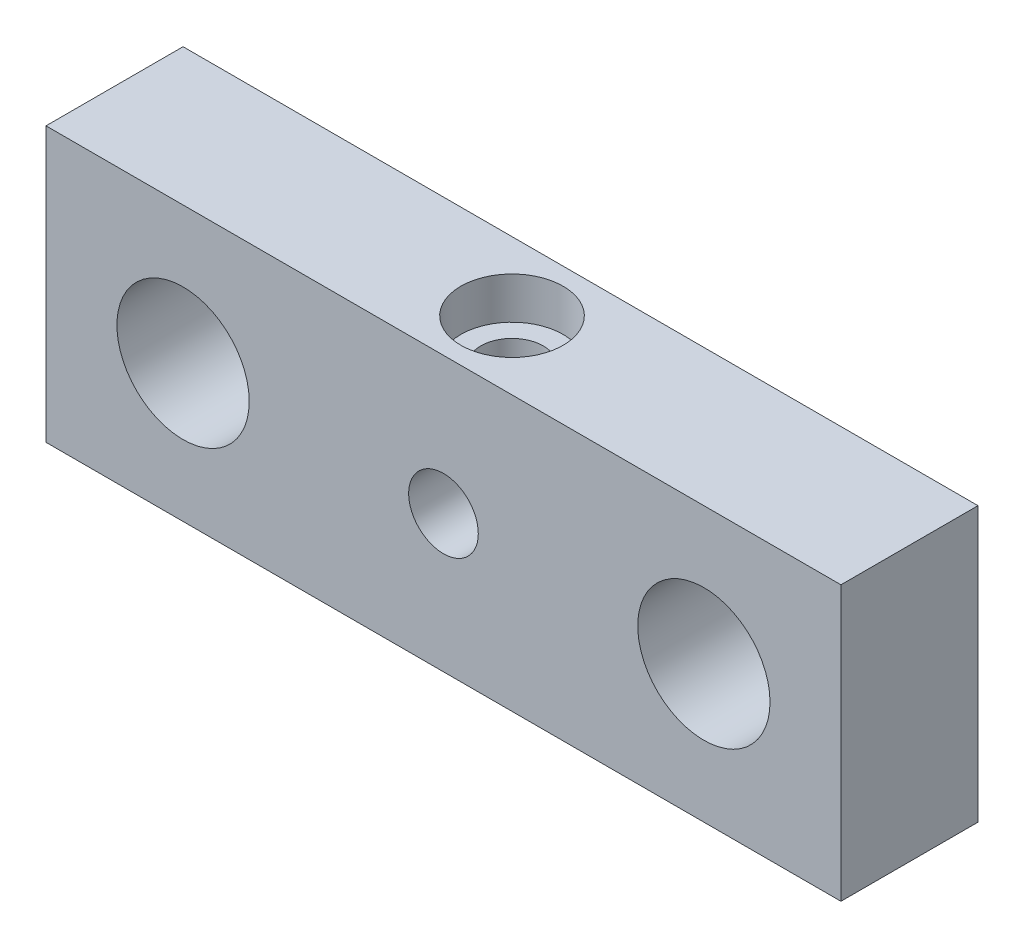
ISO-10303-21;
HEADER;
FILE_DESCRIPTION(('STEP AP214'),'2;1');
FILE_NAME('part.step','',(''),(''),'','','');
FILE_SCHEMA(('AUTOMOTIVE_DESIGN { 1 0 10303 214 1 1 1 1 }'));
ENDSEC;
DATA;
#1=APPLICATION_CONTEXT('core data for automotive mechanical design processes');
#2=APPLICATION_PROTOCOL_DEFINITION('international standard','automotive_design',2000,#1);
#3=PRODUCT_CONTEXT('',#1,'mechanical');
#4=PRODUCT('Part','Part','',(#3));
#5=PRODUCT_RELATED_PRODUCT_CATEGORY('part','',(#4));
#6=PRODUCT_DEFINITION_FORMATION('','',#4);
#7=PRODUCT_DEFINITION_CONTEXT('part definition',#1,'design');
#8=PRODUCT_DEFINITION('design','',#6,#7);
#9=PRODUCT_DEFINITION_SHAPE('','',#8);
#10=(LENGTH_UNIT() NAMED_UNIT(*) SI_UNIT(.MILLI.,.METRE.));
#11=(NAMED_UNIT(*) PLANE_ANGLE_UNIT() SI_UNIT($,.RADIAN.));
#12=(NAMED_UNIT(*) SI_UNIT($,.STERADIAN.) SOLID_ANGLE_UNIT());
#13=UNCERTAINTY_MEASURE_WITH_UNIT(LENGTH_MEASURE(1.E-05),#10,'distance_accuracy_value','');
#14=(GEOMETRIC_REPRESENTATION_CONTEXT(3) GLOBAL_UNCERTAINTY_ASSIGNED_CONTEXT((#13)) GLOBAL_UNIT_ASSIGNED_CONTEXT((#10,
#11,#12)) REPRESENTATION_CONTEXT('',''));
#15=CARTESIAN_POINT('',(0.,0.,0.));
#16=DIRECTION('',(0.,0.,1.));
#17=DIRECTION('',(1.,0.,0.));
#18=AXIS2_PLACEMENT_3D('',#15,#16,#17);
#19=CARTESIAN_POINT('',(-14.5,5.,5.));
#20=DIRECTION('',(1.,0.,0.));
#21=DIRECTION('',(0.,1.,0.));
#22=AXIS2_PLACEMENT_3D('',#19,#20,#21);
#23=PLANE('',#22);
#24=DIRECTION('',(0.,-1.,0.));
#25=VECTOR('',#24,1.);
#26=CARTESIAN_POINT('',(-14.5,5.,0.));
#27=LINE('',#26,#25);
#28=CARTESIAN_POINT('',(-14.5,5.,0.));
#29=VERTEX_POINT('',#28);
#30=CARTESIAN_POINT('',(-14.5,-5.,0.));
#31=VERTEX_POINT('',#30);
#32=EDGE_CURVE('E97',#29,#31,#27,.T.);
#33=ORIENTED_EDGE('',*,*,#32,.T.);
#34=DIRECTION('',(0.,0.,-1.));
#35=VECTOR('',#34,1.);
#36=CARTESIAN_POINT('',(-14.5,-5.,5.));
#37=LINE('',#36,#35);
#38=CARTESIAN_POINT('',(-14.5,-5.,5.));
#39=VERTEX_POINT('',#38);
#40=EDGE_CURVE('E11',#39,#31,#37,.T.);
#41=ORIENTED_EDGE('',*,*,#40,.F.);
#42=DIRECTION('',(0.,-1.,0.));
#43=VECTOR('',#42,1.);
#44=CARTESIAN_POINT('',(-14.5,5.,5.));
#45=LINE('',#44,#43);
#46=CARTESIAN_POINT('',(-14.5,5.,5.));
#47=VERTEX_POINT('',#46);
#48=EDGE_CURVE('E85',#47,#39,#45,.T.);
#49=ORIENTED_EDGE('',*,*,#48,.F.);
#50=DIRECTION('',(0.,0.,-1.));
#51=VECTOR('',#50,1.);
#52=CARTESIAN_POINT('',(-14.5,5.,5.));
#53=LINE('',#52,#51);
#54=EDGE_CURVE('E93',#47,#29,#53,.T.);
#55=ORIENTED_EDGE('',*,*,#54,.T.);
#56=EDGE_LOOP('',(#33,#41,#49,#55));
#57=FACE_BOUND('',#56,.T.);
#58=ADVANCED_FACE('F34',(#57),#23,.F.);
#59=CARTESIAN_POINT('',(-14.5,-5.,5.));
#60=DIRECTION('',(0.,1.,0.));
#61=DIRECTION('',(0.,0.,1.));
#62=AXIS2_PLACEMENT_3D('',#59,#60,#61);
#63=PLANE('',#62);
#64=DIRECTION('',(1.,0.,0.));
#65=VECTOR('',#64,1.);
#66=CARTESIAN_POINT('',(-14.5,-5.,0.));
#67=LINE('',#66,#65);
#68=CARTESIAN_POINT('',(14.5,-5.,0.));
#69=VERTEX_POINT('',#68);
#70=EDGE_CURVE('E89',#31,#69,#67,.T.);
#71=ORIENTED_EDGE('',*,*,#70,.T.);
#72=DIRECTION('',(0.,0.,-1.));
#73=VECTOR('',#72,1.);
#74=CARTESIAN_POINT('',(14.5,-5.,5.));
#75=LINE('',#74,#73);
#76=CARTESIAN_POINT('',(14.5,-5.,5.));
#77=VERTEX_POINT('',#76);
#78=EDGE_CURVE('E42',#77,#69,#75,.T.);
#79=ORIENTED_EDGE('',*,*,#78,.F.);
#80=DIRECTION('',(1.,0.,0.));
#81=VECTOR('',#80,1.);
#82=CARTESIAN_POINT('',(-14.5,-5.,5.));
#83=LINE('',#82,#81);
#84=EDGE_CURVE('E80',#39,#77,#83,.T.);
#85=ORIENTED_EDGE('',*,*,#84,.F.);
#86=ORIENTED_EDGE('',*,*,#40,.T.);
#87=EDGE_LOOP('',(#71,#79,#85,#86));
#88=FACE_BOUND('',#87,.T.);
#89=ADVANCED_FACE('F88',(#88),#63,.F.);
#90=CARTESIAN_POINT('',(14.5,5.,5.));
#91=DIRECTION('',(-1.,0.,0.));
#92=DIRECTION('',(0.,-1.,0.));
#93=AXIS2_PLACEMENT_3D('',#90,#91,#92);
#94=PLANE('',#93);
#95=DIRECTION('',(0.,1.,0.));
#96=VECTOR('',#95,1.);
#97=CARTESIAN_POINT('',(14.5,5.,0.));
#98=LINE('',#97,#96);
#99=CARTESIAN_POINT('',(14.5,5.,0.));
#100=VERTEX_POINT('',#99);
#101=EDGE_CURVE('E67',#69,#100,#98,.T.);
#102=ORIENTED_EDGE('',*,*,#101,.T.);
#103=DIRECTION('',(0.,0.,-1.));
#104=VECTOR('',#103,1.);
#105=CARTESIAN_POINT('',(14.5,5.,5.));
#106=LINE('',#105,#104);
#107=CARTESIAN_POINT('',(14.5,5.,5.));
#108=VERTEX_POINT('',#107);
#109=EDGE_CURVE('E90',#108,#100,#106,.T.);
#110=ORIENTED_EDGE('',*,*,#109,.F.);
#111=DIRECTION('',(0.,1.,0.));
#112=VECTOR('',#111,1.);
#113=CARTESIAN_POINT('',(14.5,5.,5.));
#114=LINE('',#113,#112);
#115=EDGE_CURVE('E83',#77,#108,#114,.T.);
#116=ORIENTED_EDGE('',*,*,#115,.F.);
#117=ORIENTED_EDGE('',*,*,#78,.T.);
#118=EDGE_LOOP('',(#102,#110,#116,#117));
#119=FACE_BOUND('',#118,.T.);
#120=ADVANCED_FACE('F91',(#119),#94,.F.);
#121=CARTESIAN_POINT('',(-14.5,5.,5.));
#122=DIRECTION('',(0.,-1.,0.));
#123=DIRECTION('',(1.,0.,0.));
#124=AXIS2_PLACEMENT_3D('',#121,#122,#123);
#125=PLANE('',#124);
#126=CARTESIAN_POINT('',(0.,5.,2.5));
#127=DIRECTION('',(0.,1.,0.));
#128=DIRECTION('',(-1.,0.,0.));
#129=AXIS2_PLACEMENT_3D('',#126,#127,#128);
#130=CIRCLE('',#129,1.8669);
#131=CARTESIAN_POINT('',(-1.8669,5.,2.5));
#132=VERTEX_POINT('',#131);
#133=EDGE_CURVE('E129',#132,#132,#130,.T.);
#134=ORIENTED_EDGE('',*,*,#133,.F.);
#135=EDGE_LOOP('',(#134));
#136=FACE_BOUND('',#135,.T.);
#137=DIRECTION('',(-1.,0.,0.));
#138=VECTOR('',#137,1.);
#139=CARTESIAN_POINT('',(-14.5,5.,0.));
#140=LINE('',#139,#138);
#141=EDGE_CURVE('E73',#100,#29,#140,.T.);
#142=ORIENTED_EDGE('',*,*,#141,.T.);
#143=ORIENTED_EDGE('',*,*,#54,.F.);
#144=DIRECTION('',(-1.,0.,0.));
#145=VECTOR('',#144,1.);
#146=CARTESIAN_POINT('',(-14.5,5.,5.));
#147=LINE('',#146,#145);
#148=EDGE_CURVE('E50',#108,#47,#147,.T.);
#149=ORIENTED_EDGE('',*,*,#148,.F.);
#150=ORIENTED_EDGE('',*,*,#109,.T.);
#151=EDGE_LOOP('',(#142,#143,#149,#150));
#152=FACE_BOUND('',#151,.T.);
#153=ADVANCED_FACE('F105',(#136,#152),#125,.F.);
#154=CARTESIAN_POINT('',(0.,0.,5.));
#155=DIRECTION('',(0.,0.,1.));
#156=DIRECTION('',(1.,0.,0.));
#157=AXIS2_PLACEMENT_3D('',#154,#155,#156);
#158=PLANE('',#157);
#159=CARTESIAN_POINT('',(0.,0.,5.));
#160=DIRECTION('',(0.,0.,1.));
#161=DIRECTION('',(1.,0.,0.));
#162=AXIS2_PLACEMENT_3D('',#159,#160,#161);
#163=CIRCLE('',#162,1.27);
#164=CARTESIAN_POINT('',(1.27,0.,5.));
#165=VERTEX_POINT('',#164);
#166=EDGE_CURVE('E123',#165,#165,#163,.T.);
#167=ORIENTED_EDGE('',*,*,#166,.F.);
#168=EDGE_LOOP('',(#167));
#169=FACE_BOUND('',#168,.T.);
#170=CARTESIAN_POINT('',(9.5,0.,5.));
#171=DIRECTION('',(0.,0.,1.));
#172=DIRECTION('',(1.,0.,0.));
#173=AXIS2_PLACEMENT_3D('',#170,#171,#172);
#174=CIRCLE('',#173,2.413);
#175=CARTESIAN_POINT('',(11.913,0.,5.));
#176=VERTEX_POINT('',#175);
#177=EDGE_CURVE('E117',#176,#176,#174,.T.);
#178=ORIENTED_EDGE('',*,*,#177,.F.);
#179=EDGE_LOOP('',(#178));
#180=FACE_BOUND('',#179,.T.);
#181=CARTESIAN_POINT('',(-9.5,0.,5.));
#182=DIRECTION('',(0.,0.,1.));
#183=DIRECTION('',(1.,0.,0.));
#184=AXIS2_PLACEMENT_3D('',#181,#182,#183);
#185=CIRCLE('',#184,2.413);
#186=CARTESIAN_POINT('',(-7.087,0.,5.));
#187=VERTEX_POINT('',#186);
#188=EDGE_CURVE('E111',#187,#187,#185,.T.);
#189=ORIENTED_EDGE('',*,*,#188,.F.);
#190=EDGE_LOOP('',(#189));
#191=FACE_BOUND('',#190,.T.);
#192=ORIENTED_EDGE('',*,*,#48,.T.);
#193=ORIENTED_EDGE('',*,*,#84,.T.);
#194=ORIENTED_EDGE('',*,*,#115,.T.);
#195=ORIENTED_EDGE('',*,*,#148,.T.);
#196=EDGE_LOOP('',(#192,#193,#194,#195));
#197=FACE_BOUND('',#196,.T.);
#198=ADVANCED_FACE('F81',(#169,#180,#191,#197),#158,.T.);
#199=CARTESIAN_POINT('',(0.,0.,0.));
#200=DIRECTION('',(0.,0.,1.));
#201=DIRECTION('',(1.,0.,0.));
#202=AXIS2_PLACEMENT_3D('',#199,#200,#201);
#203=PLANE('',#202);
#204=CARTESIAN_POINT('',(0.,0.,0.));
#205=DIRECTION('',(0.,0.,1.));
#206=DIRECTION('',(1.,0.,0.));
#207=AXIS2_PLACEMENT_3D('',#204,#205,#206);
#208=CIRCLE('',#207,1.27);
#209=CARTESIAN_POINT('',(1.27,0.,0.));
#210=VERTEX_POINT('',#209);
#211=EDGE_CURVE('E120',#210,#210,#208,.T.);
#212=ORIENTED_EDGE('',*,*,#211,.T.);
#213=EDGE_LOOP('',(#212));
#214=FACE_BOUND('',#213,.T.);
#215=CARTESIAN_POINT('',(9.5,0.,0.));
#216=DIRECTION('',(0.,0.,1.));
#217=DIRECTION('',(1.,0.,0.));
#218=AXIS2_PLACEMENT_3D('',#215,#216,#217);
#219=CIRCLE('',#218,2.413);
#220=CARTESIAN_POINT('',(11.913,0.,0.));
#221=VERTEX_POINT('',#220);
#222=EDGE_CURVE('E114',#221,#221,#219,.T.);
#223=ORIENTED_EDGE('',*,*,#222,.T.);
#224=EDGE_LOOP('',(#223));
#225=FACE_BOUND('',#224,.T.);
#226=CARTESIAN_POINT('',(-9.5,0.,0.));
#227=DIRECTION('',(0.,0.,1.));
#228=DIRECTION('',(1.,0.,0.));
#229=AXIS2_PLACEMENT_3D('',#226,#227,#228);
#230=CIRCLE('',#229,2.413);
#231=CARTESIAN_POINT('',(-7.087,0.,0.));
#232=VERTEX_POINT('',#231);
#233=EDGE_CURVE('E100',#232,#232,#230,.T.);
#234=ORIENTED_EDGE('',*,*,#233,.T.);
#235=EDGE_LOOP('',(#234));
#236=FACE_BOUND('',#235,.T.);
#237=ORIENTED_EDGE('',*,*,#32,.F.);
#238=ORIENTED_EDGE('',*,*,#141,.F.);
#239=ORIENTED_EDGE('',*,*,#101,.F.);
#240=ORIENTED_EDGE('',*,*,#70,.F.);
#241=EDGE_LOOP('',(#237,#238,#239,#240));
#242=FACE_BOUND('',#241,.T.);
#243=ADVANCED_FACE('F108',(#214,#225,#236,#242),#203,.F.);
#244=CARTESIAN_POINT('',(-9.5,0.,0.));
#245=DIRECTION('',(0.,0.,1.));
#246=DIRECTION('',(1.,0.,0.));
#247=AXIS2_PLACEMENT_3D('',#244,#245,#246);
#248=CYLINDRICAL_SURFACE('',#247,2.413);
#249=ORIENTED_EDGE('',*,*,#233,.F.);
#250=EDGE_LOOP('',(#249));
#251=FACE_BOUND('',#250,.T.);
#252=ORIENTED_EDGE('',*,*,#188,.T.);
#253=EDGE_LOOP('',(#252));
#254=FACE_BOUND('',#253,.T.);
#255=ADVANCED_FACE('F164',(#251,#254),#248,.F.);
#256=CARTESIAN_POINT('',(9.5,0.,0.));
#257=DIRECTION('',(0.,0.,1.));
#258=DIRECTION('',(1.,0.,0.));
#259=AXIS2_PLACEMENT_3D('',#256,#257,#258);
#260=CYLINDRICAL_SURFACE('',#259,2.413);
#261=ORIENTED_EDGE('',*,*,#222,.F.);
#262=EDGE_LOOP('',(#261));
#263=FACE_BOUND('',#262,.T.);
#264=ORIENTED_EDGE('',*,*,#177,.T.);
#265=EDGE_LOOP('',(#264));
#266=FACE_BOUND('',#265,.T.);
#267=ADVANCED_FACE('F160',(#263,#266),#260,.F.);
#268=CARTESIAN_POINT('',(0.,0.,0.));
#269=DIRECTION('',(0.,0.,1.));
#270=DIRECTION('',(1.,0.,0.));
#271=AXIS2_PLACEMENT_3D('',#268,#269,#270);
#272=CYLINDRICAL_SURFACE('',#271,1.27);
#273=CARTESIAN_POINT('',(-1.143,0.553580165829666,2.5));
#274=CARTESIAN_POINT('',(-1.14299671661189,0.553591448973168,2.46576067109671));
#275=CARTESIAN_POINT('',(-1.14143791823582,0.556839999382848,2.43147148473355));
#276=CARTESIAN_POINT('',(-1.13540799186881,0.569025294557148,2.36415435359919));
#277=CARTESIAN_POINT('',(-1.1309252292204,0.577984760194457,2.33113200786519));
#278=CARTESIAN_POINT('',(-1.11670520487639,0.605141337430541,2.25149131853141));
#279=CARTESIAN_POINT('',(-1.10547714752844,0.625709224174901,2.20598341189794));
#280=CARTESIAN_POINT('',(-1.0784712508916,0.671198422939923,2.11861635664027));
#281=CARTESIAN_POINT('',(-1.06267532102583,0.696136886349666,2.0767725951588));
#282=CARTESIAN_POINT('',(-1.02948911515305,0.744164247579775,2.00198555460496));
#283=CARTESIAN_POINT('',(-1.01265708082924,0.767001393756939,1.96862884936949));
#284=CARTESIAN_POINT('',(-0.975989896567032,0.813151513391607,1.90394966607919));
#285=CARTESIAN_POINT('',(-0.956152856074151,0.836464778346598,1.87262848649791));
#286=CARTESIAN_POINT('',(-0.892165686090752,0.906031528796872,1.78167912781928));
#287=CARTESIAN_POINT('',(-0.843468001852132,0.952022390491098,1.72490501027925));
#288=CARTESIAN_POINT('',(-0.747001808609052,1.02845353892412,1.63297863568416));
#289=CARTESIAN_POINT('',(-0.701875502757225,1.0599591577804,1.59592274204517));
#290=CARTESIAN_POINT('',(-0.604464660698915,1.11836024786861,1.5281051320662));
#291=CARTESIAN_POINT('',(-0.552192705402931,1.14526363858207,1.49733258534825));
#292=CARTESIAN_POINT('',(-0.451901273439673,1.18787464807055,1.44895429112043));
#293=CARTESIAN_POINT('',(-0.405054189453581,1.20474302890109,1.42995015938432));
#294=CARTESIAN_POINT('',(-0.307784122243165,1.2331785344472,1.39803290963273));
#295=CARTESIAN_POINT('',(-0.257363298183397,1.24474882913296,1.38511614926356));
#296=CARTESIAN_POINT('',(-0.153885329083046,1.26173768206175,1.36617963900779));
#297=CARTESIAN_POINT('',(-0.100814233572739,1.26711907523078,1.36020155471824));
#298=CARTESIAN_POINT('',(0.00589232551169075,1.27110665027406,1.35577002307274));
#299=CARTESIAN_POINT('',(0.0595276010043779,1.26971502284972,1.35731414269572));
#300=CARTESIAN_POINT('',(0.160289410339568,1.26076040906054,1.36727335522903));
#301=CARTESIAN_POINT('',(0.207542072194061,1.25381007153569,1.37500639626485));
#302=CARTESIAN_POINT('',(0.299775375600207,1.23501073516504,1.39599719104851));
#303=CARTESIAN_POINT('',(0.344755526883065,1.22316068428223,1.40925613128909));
#304=CARTESIAN_POINT('',(0.43399283223964,1.19451536034773,1.44147570134928));
#305=CARTESIAN_POINT('',(0.47807352309411,1.17748354021777,1.46071028917226));
#306=CARTESIAN_POINT('',(0.56221529799033,1.13971286311318,1.50370744234266));
#307=CARTESIAN_POINT('',(0.602275087971741,1.11897281864287,1.52747145832372));
#308=CARTESIAN_POINT('',(0.69813136970057,1.06301534202422,1.59228388587098));
#309=CARTESIAN_POINT('',(0.751135822144396,1.02591717653487,1.63585305483729));
#310=CARTESIAN_POINT('',(0.847443834167001,0.947947874627542,1.73002967580681));
#311=CARTESIAN_POINT('',(0.890708239519619,0.907062410807736,1.78066425499328));
#312=CARTESIAN_POINT('',(0.968644315165077,0.823373488935226,1.88944577276535));
#313=CARTESIAN_POINT('',(1.00308056264227,0.780547573408735,1.94774586814577));
#314=CARTESIAN_POINT('',(1.04710253251959,0.719109105680243,2.04045341005871));
#315=CARTESIAN_POINT('',(1.06049123411447,0.699121977487994,2.07218482240882));
#316=CARTESIAN_POINT('',(1.08462522940042,0.661052780743918,2.13770673324337));
#317=CARTESIAN_POINT('',(1.0953745482402,0.6429678356826,2.1714939970396));
#318=CARTESIAN_POINT('',(1.11252335751773,0.612737063977619,2.23604079387782));
#319=CARTESIAN_POINT('',(1.11933913691578,0.600105062233219,2.26645554842499));
#320=CARTESIAN_POINT('',(1.13057905878899,0.578651958021702,2.32899021195052));
#321=CARTESIAN_POINT('',(1.13500998636475,0.5698200584848,2.36110499479219));
#322=CARTESIAN_POINT('',(1.14116422843509,0.557402678152433,2.42717112591402));
#323=CARTESIAN_POINT('',(1.14284551585114,0.553898687818663,2.46114292397831));
#324=CARTESIAN_POINT('',(1.14313388615445,0.553304172298259,2.52915276243845));
#325=CARTESIAN_POINT('',(1.14174146630066,0.556212609720272,2.56319079122954));
#326=CARTESIAN_POINT('',(1.13583593971323,0.568171917629999,2.63288735177058));
#327=CARTESIAN_POINT('',(1.13106219261692,0.577734538886814,2.66842971152271));
#328=CARTESIAN_POINT('',(1.11861692230206,0.601478708723341,2.73745195755823));
#329=CARTESIAN_POINT('',(1.11093341863414,0.615679319757489,2.77092264201051));
#330=CARTESIAN_POINT('',(1.08557877223686,0.659915388408753,2.86306855906061));
#331=CARTESIAN_POINT('',(1.06493876186263,0.693234174348962,2.91930646585352));
#332=CARTESIAN_POINT('',(1.0162700116806,0.762846242390443,3.02640279702269));
#333=CARTESIAN_POINT('',(0.988226053488851,0.799145543651742,3.07724983555611));
#334=CARTESIAN_POINT('',(0.921339269877472,0.875723967001805,3.1794901780716));
#335=CARTESIAN_POINT('',(0.881651632956133,0.916004838457469,3.23033682576818));
#336=CARTESIAN_POINT('',(0.793036374073634,0.993712437609172,3.32568892045049));
#337=CARTESIAN_POINT('',(0.744124878776215,1.0311439889912,3.37020520046416));
#338=CARTESIAN_POINT('',(0.647878911621228,1.09349626632164,3.44316537725433));
#339=CARTESIAN_POINT('',(0.60227534373051,1.1194088517459,3.47303347045798));
#340=CARTESIAN_POINT('',(0.505331896522425,1.16637465108018,3.52671706950145));
#341=CARTESIAN_POINT('',(0.453998440391082,1.18743322671249,3.5505392565971));
#342=CARTESIAN_POINT('',(0.354773979776243,1.22038002379507,3.58762887377227));
#343=CARTESIAN_POINT('',(0.307589432633865,1.23318513888488,3.60196166838362));
#344=CARTESIAN_POINT('',(0.21065984196433,1.25338231371474,3.62451844512546));
#345=CARTESIAN_POINT('',(0.160916428246666,1.26077777441396,3.63274626539799));
#346=CARTESIAN_POINT('',(0.0600592490104684,1.26959171894152,3.64254839101834));
#347=CARTESIAN_POINT('',(0.00894121069530701,1.27098868383482,3.64409874174918));
#348=CARTESIAN_POINT('',(-0.0928381174143984,1.26762536898022,3.64036121831361));
#349=CARTESIAN_POINT('',(-0.143499378620594,1.26286470650127,3.63507291908678));
#350=CARTESIAN_POINT('',(-0.240004169045541,1.24801811898771,3.61853055706194));
#351=CARTESIAN_POINT('',(-0.285958474054009,1.23824631032445,3.60762824946024));
#352=CARTESIAN_POINT('',(-0.375089038698122,1.21422513459733,3.58070723394695));
#353=CARTESIAN_POINT('',(-0.418264470508209,1.19997444064477,3.56468700980779));
#354=CARTESIAN_POINT('',(-0.516184220268803,1.16194438231142,3.52166561725748));
#355=CARTESIAN_POINT('',(-0.569490765730393,1.13658185195737,3.4927877314413));
#356=CARTESIAN_POINT('',(-0.669186327598179,1.0809120368174,3.42853346214125));
#357=CARTESIAN_POINT('',(-0.715558374479032,1.05059299009694,3.39314159504603));
#358=CARTESIAN_POINT('',(-0.814370610201588,0.977010363029929,3.30551157094609));
#359=CARTESIAN_POINT('',(-0.864345680291143,0.932619664574832,3.25142808149934));
#360=CARTESIAN_POINT('',(-0.93052531074752,0.864884652631175,3.16474931609742));
#361=CARTESIAN_POINT('',(-0.951127925607329,0.84210535607643,3.1349175883612));
#362=CARTESIAN_POINT('',(-0.989460639506353,0.796710078328378,3.07335060339153));
#363=CARTESIAN_POINT('',(-1.00719226945708,0.774094016280747,3.04161637309345));
#364=CARTESIAN_POINT('',(-1.04110881832602,0.727927162873785,2.97340489818204));
#365=CARTESIAN_POINT('',(-1.05704621606148,0.704452706735542,2.93675226215025));
#366=CARTESIAN_POINT('',(-1.08536948409341,0.659972072139597,2.86065037749133));
#367=CARTESIAN_POINT('',(-1.09775885177782,0.638963475161103,2.82120393098536));
#368=CARTESIAN_POINT('',(-1.11589893577576,0.606567196215582,2.74943708686829));
#369=CARTESIAN_POINT('',(-1.12253638404606,0.594090679153921,2.7178452425782));
#370=CARTESIAN_POINT('',(-1.13320348547085,0.573486991599389,2.65287529142847));
#371=CARTESIAN_POINT('',(-1.13724287611106,0.565343600672854,2.61950436813516));
#372=CARTESIAN_POINT('',(-1.14085274244033,0.557996640616917,2.57145727137862));
#373=CARTESIAN_POINT('',(-1.14165558948794,0.556349146277571,2.55722961664835));
#374=CARTESIAN_POINT('',(-1.14272990839676,0.554138540887429,2.52867089032551));
#375=CARTESIAN_POINT('',(-1.14300137512003,0.553575440321706,2.51433981773433));
#376=CARTESIAN_POINT('',(-1.143,0.553580165829666,2.5));
#377=B_SPLINE_CURVE_WITH_KNOTS('',3,(#273,#274,#275,#276,#277,#278,#279,#280,#281,#282,#283,
#284,#285,#286,#287,#288,#289,#290,#291,#292,#293,#294,#295,#296,#297,#298,#299,#300,#301,#302,
#303,#304,#305,#306,#307,#308,#309,#310,#311,#312,#313,#314,#315,#316,#317,#318,#319,#320,#321,
#322,#323,#324,#325,#326,#327,#328,#329,#330,#331,#332,#333,#334,#335,#336,#337,#338,#339,#340,
#341,#342,#343,#344,#345,#346,#347,#348,#349,#350,#351,#352,#353,#354,#355,#356,#357,#358,#359,
#360,#361,#362,#363,#364,#365,#366,#367,#368,#369,#370,#371,#372,#373,#374,#375,#376),
.UNSPECIFIED.,.T.,.F.,(4,2,2,2,2,2,2,2,2,2,2,2,2,2,2,2,2,2,2,2,2,2,2,2,2,2,2,2,2,2,2,2,2,2,2,2,
2,2,2,2,2,2,2,2,2,2,2,2,2,2,2,4),(0.,0.102647927718851,0.205706811028158,0.358393839370871,
0.511694049972014,0.642891309513516,0.774171455299113,1.03611691217107,1.23449674128095,
1.4325316887371,1.59177864019243,1.75093018553078,1.91103254450607,2.07108312257399,
2.21558560767014,2.3601191355967,2.51261813729946,2.66516606196342,2.89787303220639,
3.13149939498231,3.37082628867396,3.49016125438908,3.60931308383753,3.70995902551601,
3.81031708688905,3.91219521066514,4.01405685398585,4.12476913064016,4.2359422923965,
4.44047306567146,4.64542755803684,4.87276261205232,5.09970382590541,5.28013820644126,
5.46037231432904,5.6125727832132,5.76467748377739,5.91732738951059,6.06998678374686,
6.21407192097921,6.35819978434223,6.55426559159344,6.75080360782277,7.00730466584351,
7.13565927620714,7.26394521628998,7.40279269128949,7.54150282578222,7.64504897889603,
7.74820474538071,7.79119444141879,7.83418455312491),.UNSPECIFIED.);
#378=CARTESIAN_POINT('',(-1.143,0.553580165829666,2.5));
#379=VERTEX_POINT('',#378);
#380=EDGE_CURVE('E137',#379,#379,#377,.T.);
#381=ORIENTED_EDGE('',*,*,#380,.F.);
#382=EDGE_LOOP('',(#381));
#383=FACE_BOUND('',#382,.T.);
#384=ORIENTED_EDGE('',*,*,#211,.F.);
#385=EDGE_LOOP('',(#384));
#386=FACE_BOUND('',#385,.T.);
#387=ORIENTED_EDGE('',*,*,#166,.T.);
#388=EDGE_LOOP('',(#387));
#389=FACE_BOUND('',#388,.T.);
#390=ADVANCED_FACE('F156',(#383,#386,#389),#272,.F.);
#391=CARTESIAN_POINT('',(0.,3.476,2.5));
#392=DIRECTION('',(0.,1.,0.));
#393=DIRECTION('',(-1.,0.,0.));
#394=AXIS2_PLACEMENT_3D('',#391,#392,#393);
#395=CYLINDRICAL_SURFACE('',#394,1.8669);
#396=CARTESIAN_POINT('',(0.,3.476,2.5));
#397=DIRECTION('',(0.,1.,0.));
#398=DIRECTION('',(-1.,0.,0.));
#399=AXIS2_PLACEMENT_3D('',#396,#397,#398);
#400=CIRCLE('',#399,1.8669);
#401=CARTESIAN_POINT('',(-1.8669,3.476,2.5));
#402=VERTEX_POINT('',#401);
#403=EDGE_CURVE('E126',#402,#402,#400,.T.);
#404=CARTESIAN_POINT('',(-1.8669,3.476,2.5));
#405=CARTESIAN_POINT('',(-1.8669,3.491875,2.5));
#406=CARTESIAN_POINT('',(-1.8669,3.50775,2.5));
#407=CARTESIAN_POINT('',(-1.8669,3.5395,2.5));
#408=CARTESIAN_POINT('',(-1.8669,3.555375,2.5));
#409=CARTESIAN_POINT('',(-1.8669,3.587125,2.5));
#410=CARTESIAN_POINT('',(-1.8669,3.603,2.5));
#411=CARTESIAN_POINT('',(-1.8669,3.63475,2.5));
#412=CARTESIAN_POINT('',(-1.8669,3.650625,2.5));
#413=CARTESIAN_POINT('',(-1.8669,3.682375,2.5));
#414=CARTESIAN_POINT('',(-1.8669,3.69825,2.5));
#415=CARTESIAN_POINT('',(-1.8669,3.73,2.5));
#416=CARTESIAN_POINT('',(-1.8669,3.745875,2.5));
#417=CARTESIAN_POINT('',(-1.8669,3.777625,2.5));
#418=CARTESIAN_POINT('',(-1.8669,3.7935,2.5));
#419=CARTESIAN_POINT('',(-1.8669,3.82525,2.5));
#420=CARTESIAN_POINT('',(-1.8669,3.841125,2.5));
#421=CARTESIAN_POINT('',(-1.8669,3.872875,2.5));
#422=CARTESIAN_POINT('',(-1.8669,3.88875,2.5));
#423=CARTESIAN_POINT('',(-1.8669,3.9205,2.5));
#424=CARTESIAN_POINT('',(-1.8669,3.936375,2.5));
#425=CARTESIAN_POINT('',(-1.8669,3.968125,2.5));
#426=CARTESIAN_POINT('',(-1.8669,3.984,2.5));
#427=CARTESIAN_POINT('',(-1.8669,4.01575,2.5));
#428=CARTESIAN_POINT('',(-1.8669,4.031625,2.5));
#429=CARTESIAN_POINT('',(-1.8669,4.063375,2.5));
#430=CARTESIAN_POINT('',(-1.8669,4.07925,2.5));
#431=CARTESIAN_POINT('',(-1.8669,4.111,2.5));
#432=CARTESIAN_POINT('',(-1.8669,4.126875,2.5));
#433=CARTESIAN_POINT('',(-1.8669,4.158625,2.5));
#434=CARTESIAN_POINT('',(-1.8669,4.1745,2.5));
#435=CARTESIAN_POINT('',(-1.8669,4.20625,2.5));
#436=CARTESIAN_POINT('',(-1.8669,4.222125,2.5));
#437=CARTESIAN_POINT('',(-1.8669,4.253875,2.5));
#438=CARTESIAN_POINT('',(-1.8669,4.26975,2.5));
#439=CARTESIAN_POINT('',(-1.8669,4.3015,2.5));
#440=CARTESIAN_POINT('',(-1.8669,4.317375,2.5));
#441=CARTESIAN_POINT('',(-1.8669,4.349125,2.5));
#442=CARTESIAN_POINT('',(-1.8669,4.365,2.5));
#443=CARTESIAN_POINT('',(-1.8669,4.39675,2.5));
#444=CARTESIAN_POINT('',(-1.8669,4.412625,2.5));
#445=CARTESIAN_POINT('',(-1.8669,4.444375,2.5));
#446=CARTESIAN_POINT('',(-1.8669,4.46025,2.5));
#447=CARTESIAN_POINT('',(-1.8669,4.492,2.5));
#448=CARTESIAN_POINT('',(-1.8669,4.507875,2.5));
#449=CARTESIAN_POINT('',(-1.8669,4.539625,2.5));
#450=CARTESIAN_POINT('',(-1.8669,4.5555,2.5));
#451=CARTESIAN_POINT('',(-1.8669,4.58725,2.5));
#452=CARTESIAN_POINT('',(-1.8669,4.603125,2.5));
#453=CARTESIAN_POINT('',(-1.8669,4.634875,2.5));
#454=CARTESIAN_POINT('',(-1.8669,4.65075,2.5));
#455=CARTESIAN_POINT('',(-1.8669,4.6825,2.5));
#456=CARTESIAN_POINT('',(-1.8669,4.698375,2.5));
#457=CARTESIAN_POINT('',(-1.8669,4.730125,2.5));
#458=CARTESIAN_POINT('',(-1.8669,4.746,2.5));
#459=CARTESIAN_POINT('',(-1.8669,4.77775,2.5));
#460=CARTESIAN_POINT('',(-1.8669,4.793625,2.5));
#461=CARTESIAN_POINT('',(-1.8669,4.825375,2.5));
#462=CARTESIAN_POINT('',(-1.8669,4.84125,2.5));
#463=CARTESIAN_POINT('',(-1.8669,4.873,2.5));
#464=CARTESIAN_POINT('',(-1.8669,4.888875,2.5));
#465=CARTESIAN_POINT('',(-1.8669,4.920625,2.5));
#466=CARTESIAN_POINT('',(-1.8669,4.9365,2.5));
#467=CARTESIAN_POINT('',(-1.8669,4.96825,2.5));
#468=CARTESIAN_POINT('',(-1.8669,4.984125,2.5));
#469=CARTESIAN_POINT('',(-1.8669,5.,2.5));
#470=B_SPLINE_CURVE_WITH_KNOTS('',3,(#404,#405,#406,#407,#408,#409,#410,#411,#412,#413,#414,
#415,#416,#417,#418,#419,#420,#421,#422,#423,#424,#425,#426,#427,#428,#429,#430,#431,#432,#433,
#434,#435,#436,#437,#438,#439,#440,#441,#442,#443,#444,#445,#446,#447,#448,#449,#450,#451,#452,
#453,#454,#455,#456,#457,#458,#459,#460,#461,#462,#463,#464,#465,#466,#467,#468,#469),
.UNSPECIFIED.,.F.,.F.,(4,2,2,2,2,2,2,2,2,2,2,2,2,2,2,2,2,2,2,2,2,2,2,2,2,2,2,2,2,2,2,2,4),(0.,
0.0476250000000004,0.0952500000000003,0.142875,0.1905,0.238125,0.28575,0.333375,0.381,0.428625,
0.476250000000001,0.523875,0.5715,0.619125,0.66675,0.714375,0.762,0.809625,0.85725,0.904875,
0.9525,1.000125,1.04775,1.095375,1.143,1.190625,1.23825,1.285875,1.3335,1.381125,1.42875,
1.476375,1.524),.UNSPECIFIED.);
#471=EDGE_CURVE('BSEAM152',#402,#132,#470,.T.);
#472=ORIENTED_EDGE('',*,*,#403,.F.);
#473=ORIENTED_EDGE('',*,*,#133,.T.);
#474=ORIENTED_EDGE('',*,*,#471,.T.);
#475=ORIENTED_EDGE('',*,*,#471,.F.);
#476=EDGE_LOOP('',(#472,#474,#473,#475));
#477=FACE_BOUND('',#476,.T.);
#478=ADVANCED_FACE('F152',(#477),#395,.F.);
#479=CARTESIAN_POINT('',(0.,3.476,2.5));
#480=DIRECTION('',(0.,1.,0.));
#481=DIRECTION('',(-1.,0.,0.));
#482=AXIS2_PLACEMENT_3D('',#479,#480,#481);
#483=PLANE('',#482);
#484=CARTESIAN_POINT('',(0.,3.476,2.5));
#485=DIRECTION('',(0.,1.,0.));
#486=DIRECTION('',(-1.,0.,0.));
#487=AXIS2_PLACEMENT_3D('',#484,#485,#486);
#488=CIRCLE('',#487,1.143);
#489=CARTESIAN_POINT('',(-1.143,3.476,2.5));
#490=VERTEX_POINT('',#489);
#491=EDGE_CURVE('E132',#490,#490,#488,.T.);
#492=ORIENTED_EDGE('',*,*,#491,.F.);
#493=EDGE_LOOP('',(#492));
#494=FACE_BOUND('',#493,.T.);
#495=ORIENTED_EDGE('',*,*,#403,.T.);
#496=EDGE_LOOP('',(#495));
#497=FACE_BOUND('',#496,.T.);
#498=ADVANCED_FACE('F148',(#494,#497),#483,.T.);
#499=CARTESIAN_POINT('',(0.,-5.001,2.5));
#500=DIRECTION('',(0.,1.,0.));
#501=DIRECTION('',(-1.,0.,0.));
#502=AXIS2_PLACEMENT_3D('',#499,#500,#501);
#503=CYLINDRICAL_SURFACE('',#502,1.143);
#504=ORIENTED_EDGE('',*,*,#491,.T.);
#505=EDGE_LOOP('',(#504));
#506=FACE_BOUND('',#505,.T.);
#507=ORIENTED_EDGE('',*,*,#380,.T.);
#508=EDGE_LOOP('',(#507));
#509=FACE_BOUND('',#508,.T.);
#510=ADVANCED_FACE('F143',(#506,#509),#503,.F.);
#511=CLOSED_SHELL('',(#58,#89,#120,#153,#198,#243,#255,#267,#390,#478,#498,#510));
#512=MANIFOLD_SOLID_BREP('B2',#511);
#513=ADVANCED_BREP_SHAPE_REPRESENTATION('',(#18,#512),#14);
#514=SHAPE_DEFINITION_REPRESENTATION(#9,#513);
ENDSEC;
END-ISO-10303-21;
